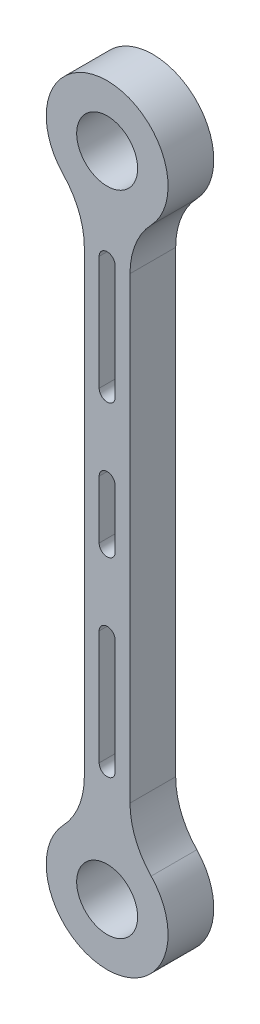
ISO-10303-21;
HEADER;
FILE_DESCRIPTION(('STEP AP214'),'2;1');
FILE_NAME('part.step','',(''),(''),'','','');
FILE_SCHEMA(('AUTOMOTIVE_DESIGN { 1 0 10303 214 1 1 1 1 }'));
ENDSEC;
DATA;
#1=APPLICATION_CONTEXT('core data for automotive mechanical design processes');
#2=APPLICATION_PROTOCOL_DEFINITION('international standard','automotive_design',2000,#1);
#3=PRODUCT_CONTEXT('',#1,'mechanical');
#4=PRODUCT('Part','Part','',(#3));
#5=PRODUCT_RELATED_PRODUCT_CATEGORY('part','',(#4));
#6=PRODUCT_DEFINITION_FORMATION('','',#4);
#7=PRODUCT_DEFINITION_CONTEXT('part definition',#1,'design');
#8=PRODUCT_DEFINITION('design','',#6,#7);
#9=PRODUCT_DEFINITION_SHAPE('','',#8);
#10=(LENGTH_UNIT() NAMED_UNIT(*) SI_UNIT(.MILLI.,.METRE.));
#11=(NAMED_UNIT(*) PLANE_ANGLE_UNIT() SI_UNIT($,.RADIAN.));
#12=(NAMED_UNIT(*) SI_UNIT($,.STERADIAN.) SOLID_ANGLE_UNIT());
#13=UNCERTAINTY_MEASURE_WITH_UNIT(LENGTH_MEASURE(1.E-05),#10,'distance_accuracy_value','');
#14=(GEOMETRIC_REPRESENTATION_CONTEXT(3) GLOBAL_UNCERTAINTY_ASSIGNED_CONTEXT((#13)) GLOBAL_UNIT_ASSIGNED_CONTEXT((#10,
#11,#12)) REPRESENTATION_CONTEXT('',''));
#15=CARTESIAN_POINT('',(0.,0.,0.));
#16=DIRECTION('',(0.,0.,1.));
#17=DIRECTION('',(1.,0.,0.));
#18=AXIS2_PLACEMENT_3D('',#15,#16,#17);
#19=CARTESIAN_POINT('',(3.,0.,6.));
#20=DIRECTION('',(1.,0.,0.));
#21=DIRECTION('',(0.,1.,0.));
#22=AXIS2_PLACEMENT_3D('',#19,#20,#21);
#23=PLANE('',#22);
#24=DIRECTION('',(0.,-1.,0.));
#25=VECTOR('',#24,1.);
#26=CARTESIAN_POINT('',(3.,0.,6.));
#27=LINE('',#26,#25);
#28=CARTESIAN_POINT('',(3.,-12.4498995979887,6.));
#29=VERTEX_POINT('',#28);
#30=CARTESIAN_POINT('',(3.00000000000001,-72.6501004020113,6.));
#31=VERTEX_POINT('',#30);
#32=EDGE_CURVE('E229',#29,#31,#27,.T.);
#33=ORIENTED_EDGE('',*,*,#32,.T.);
#34=DIRECTION('',(0.,0.,-1.));
#35=VECTOR('',#34,1.);
#36=CARTESIAN_POINT('',(3.00000000000001,-72.6501004020113,6.));
#37=LINE('',#36,#35);
#38=CARTESIAN_POINT('',(3.00000000000001,-72.6501004020113,0.));
#39=VERTEX_POINT('',#38);
#40=EDGE_CURVE('E317',#31,#39,#37,.T.);
#41=ORIENTED_EDGE('',*,*,#40,.T.);
#42=DIRECTION('',(0.,-1.,0.));
#43=VECTOR('',#42,1.);
#44=CARTESIAN_POINT('',(3.,0.,0.));
#45=LINE('',#44,#43);
#46=CARTESIAN_POINT('',(3.,-12.4498995979887,0.));
#47=VERTEX_POINT('',#46);
#48=EDGE_CURVE('E280',#47,#39,#45,.T.);
#49=ORIENTED_EDGE('',*,*,#48,.F.);
#50=DIRECTION('',(0.,0.,-1.));
#51=VECTOR('',#50,1.);
#52=CARTESIAN_POINT('',(3.,-12.4498995979887,6.));
#53=LINE('',#52,#51);
#54=EDGE_CURVE('E305',#47,#29,#53,.F.);
#55=ORIENTED_EDGE('',*,*,#54,.T.);
#56=EDGE_LOOP('',(#33,#41,#49,#55));
#57=FACE_BOUND('',#56,.T.);
#58=ADVANCED_FACE('F38',(#57),#23,.T.);
#59=CARTESIAN_POINT('',(0.,0.,6.));
#60=DIRECTION('',(0.,0.,-1.));
#61=DIRECTION('',(-1.,0.,0.));
#62=AXIS2_PLACEMENT_3D('',#59,#60,#61);
#63=CYLINDRICAL_SURFACE('',#62,8.);
#64=CARTESIAN_POINT('',(0.,0.,6.));
#65=DIRECTION('',(0.,0.,1.));
#66=DIRECTION('',(1.,0.,0.));
#67=AXIS2_PLACEMENT_3D('',#64,#65,#66);
#68=CIRCLE('',#67,8.);
#69=CARTESIAN_POINT('',(5.77777777777778,-5.53328871021721,6.));
#70=VERTEX_POINT('',#69);
#71=CARTESIAN_POINT('',(-5.77777777777778,-5.53328871021722,6.));
#72=VERTEX_POINT('',#71);
#73=EDGE_CURVE('E232',#70,#72,#68,.T.);
#74=ORIENTED_EDGE('',*,*,#73,.F.);
#75=DIRECTION('',(0.,0.,-1.));
#76=VECTOR('',#75,1.);
#77=CARTESIAN_POINT('',(5.77777777777778,-5.53328871021721,6.));
#78=LINE('',#77,#76);
#79=CARTESIAN_POINT('',(5.77777777777778,-5.53328871021721,0.));
#80=VERTEX_POINT('',#79);
#81=EDGE_CURVE('E331',#70,#80,#78,.T.);
#82=ORIENTED_EDGE('',*,*,#81,.T.);
#83=CARTESIAN_POINT('',(0.,0.,0.));
#84=DIRECTION('',(0.,0.,1.));
#85=DIRECTION('',(1.,0.,0.));
#86=AXIS2_PLACEMENT_3D('',#83,#84,#85);
#87=CIRCLE('',#86,8.);
#88=CARTESIAN_POINT('',(-5.77777777777778,-5.53328871021722,0.));
#89=VERTEX_POINT('',#88);
#90=EDGE_CURVE('E283',#80,#89,#87,.T.);
#91=ORIENTED_EDGE('',*,*,#90,.T.);
#92=DIRECTION('',(0.,0.,-1.));
#93=VECTOR('',#92,1.);
#94=CARTESIAN_POINT('',(-5.77777777777778,-5.53328871021722,6.));
#95=LINE('',#94,#93);
#96=EDGE_CURVE('E53',#89,#72,#95,.F.);
#97=ORIENTED_EDGE('',*,*,#96,.T.);
#98=EDGE_LOOP('',(#74,#82,#91,#97));
#99=FACE_BOUND('',#98,.T.);
#100=ADVANCED_FACE('F351',(#99),#63,.T.);
#101=CARTESIAN_POINT('',(-3.,0.,6.));
#102=DIRECTION('',(1.,0.,0.));
#103=DIRECTION('',(0.,1.,0.));
#104=AXIS2_PLACEMENT_3D('',#101,#102,#103);
#105=PLANE('',#104);
#106=DIRECTION('',(0.,-1.,0.));
#107=VECTOR('',#106,1.);
#108=CARTESIAN_POINT('',(-3.,0.,0.));
#109=LINE('',#108,#107);
#110=CARTESIAN_POINT('',(-3.,-12.4498995979887,0.));
#111=VERTEX_POINT('',#110);
#112=CARTESIAN_POINT('',(-2.99999999999999,-72.6501004020112,0.));
#113=VERTEX_POINT('',#112);
#114=EDGE_CURVE('E285',#111,#113,#109,.T.);
#115=ORIENTED_EDGE('',*,*,#114,.T.);
#116=DIRECTION('',(0.,0.,1.));
#117=VECTOR('',#116,1.);
#118=CARTESIAN_POINT('',(-2.99999999999999,-72.6501004020112,6.));
#119=LINE('',#118,#117);
#120=CARTESIAN_POINT('',(-2.99999999999999,-72.6501004020112,6.));
#121=VERTEX_POINT('',#120);
#122=EDGE_CURVE('E328',#113,#121,#119,.T.);
#123=ORIENTED_EDGE('',*,*,#122,.T.);
#124=DIRECTION('',(0.,-1.,0.));
#125=VECTOR('',#124,1.);
#126=CARTESIAN_POINT('',(-3.,0.,6.));
#127=LINE('',#126,#125);
#128=CARTESIAN_POINT('',(-3.,-12.4498995979887,6.));
#129=VERTEX_POINT('',#128);
#130=EDGE_CURVE('E234',#129,#121,#127,.T.);
#131=ORIENTED_EDGE('',*,*,#130,.F.);
#132=DIRECTION('',(0.,0.,1.));
#133=VECTOR('',#132,1.);
#134=CARTESIAN_POINT('',(-3.,-12.4498995979887,0.));
#135=LINE('',#134,#133);
#136=EDGE_CURVE('E325',#129,#111,#135,.F.);
#137=ORIENTED_EDGE('',*,*,#136,.T.);
#138=EDGE_LOOP('',(#115,#123,#131,#137));
#139=FACE_BOUND('',#138,.T.);
#140=ADVANCED_FACE('F358',(#139),#105,.F.);
#141=CARTESIAN_POINT('',(0.,-27.5,6.));
#142=DIRECTION('',(0.,0.,-1.));
#143=DIRECTION('',(-1.,0.,0.));
#144=AXIS2_PLACEMENT_3D('',#141,#142,#143);
#145=CYLINDRICAL_SURFACE('',#144,1.05);
#146=CARTESIAN_POINT('',(0.,-27.5,0.));
#147=DIRECTION('',(0.,0.,1.));
#148=DIRECTION('',(1.,0.,0.));
#149=AXIS2_PLACEMENT_3D('',#146,#147,#148);
#150=CIRCLE('',#149,1.05);
#151=CARTESIAN_POINT('',(-1.05,-27.5,0.));
#152=VERTEX_POINT('',#151);
#153=CARTESIAN_POINT('',(1.05,-27.5,0.));
#154=VERTEX_POINT('',#153);
#155=EDGE_CURVE('E268',#152,#154,#150,.T.);
#156=ORIENTED_EDGE('',*,*,#155,.F.);
#157=DIRECTION('',(0.,0.,-1.));
#158=VECTOR('',#157,1.);
#159=CARTESIAN_POINT('',(-1.05,-27.5,6.));
#160=LINE('',#159,#158);
#161=CARTESIAN_POINT('',(-1.05,-27.5,6.));
#162=VERTEX_POINT('',#161);
#163=EDGE_CURVE('E303',#162,#152,#160,.T.);
#164=ORIENTED_EDGE('',*,*,#163,.F.);
#165=CARTESIAN_POINT('',(0.,-27.5,6.));
#166=DIRECTION('',(0.,0.,1.));
#167=DIRECTION('',(1.,0.,0.));
#168=AXIS2_PLACEMENT_3D('',#165,#166,#167);
#169=CIRCLE('',#168,1.05);
#170=CARTESIAN_POINT('',(1.05,-27.5,6.));
#171=VERTEX_POINT('',#170);
#172=EDGE_CURVE('E218',#162,#171,#169,.T.);
#173=ORIENTED_EDGE('',*,*,#172,.T.);
#174=DIRECTION('',(0.,0.,-1.));
#175=VECTOR('',#174,1.);
#176=CARTESIAN_POINT('',(1.05,-27.5,6.));
#177=LINE('',#176,#175);
#178=EDGE_CURVE('E296',#171,#154,#177,.T.);
#179=ORIENTED_EDGE('',*,*,#178,.T.);
#180=EDGE_LOOP('',(#156,#164,#173,#179));
#181=FACE_BOUND('',#180,.T.);
#182=ADVANCED_FACE('F404',(#181),#145,.F.);
#183=CARTESIAN_POINT('',(-1.04999999999999,0.,6.));
#184=DIRECTION('',(1.,0.,0.));
#185=DIRECTION('',(0.,1.,0.));
#186=AXIS2_PLACEMENT_3D('',#183,#184,#185);
#187=PLANE('',#186);
#188=DIRECTION('',(0.,-1.,0.));
#189=VECTOR('',#188,1.);
#190=CARTESIAN_POINT('',(-1.04999999999999,0.,0.));
#191=LINE('',#190,#189);
#192=CARTESIAN_POINT('',(-1.04999999999999,-12.5,0.));
#193=VERTEX_POINT('',#192);
#194=EDGE_CURVE('E271',#193,#152,#191,.T.);
#195=ORIENTED_EDGE('',*,*,#194,.F.);
#196=DIRECTION('',(0.,0.,-1.));
#197=VECTOR('',#196,1.);
#198=CARTESIAN_POINT('',(-1.04999999999999,-12.5,6.));
#199=LINE('',#198,#197);
#200=CARTESIAN_POINT('',(-1.04999999999999,-12.5,6.));
#201=VERTEX_POINT('',#200);
#202=EDGE_CURVE('E301',#201,#193,#199,.T.);
#203=ORIENTED_EDGE('',*,*,#202,.F.);
#204=DIRECTION('',(0.,-1.,0.));
#205=VECTOR('',#204,1.);
#206=CARTESIAN_POINT('',(-1.04999999999999,0.,6.));
#207=LINE('',#206,#205);
#208=EDGE_CURVE('E221',#201,#162,#207,.T.);
#209=ORIENTED_EDGE('',*,*,#208,.T.);
#210=ORIENTED_EDGE('',*,*,#163,.T.);
#211=EDGE_LOOP('',(#195,#203,#209,#210));
#212=FACE_BOUND('',#211,.T.);
#213=ADVANCED_FACE('F400',(#212),#187,.T.);
#214=CARTESIAN_POINT('',(0.,-12.5,6.));
#215=DIRECTION('',(0.,0.,-1.));
#216=DIRECTION('',(-1.,0.,0.));
#217=AXIS2_PLACEMENT_3D('',#214,#215,#216);
#218=CYLINDRICAL_SURFACE('',#217,1.05);
#219=CARTESIAN_POINT('',(0.,-12.5,0.));
#220=DIRECTION('',(0.,0.,1.));
#221=DIRECTION('',(1.,0.,0.));
#222=AXIS2_PLACEMENT_3D('',#219,#220,#221);
#223=CIRCLE('',#222,1.05);
#224=CARTESIAN_POINT('',(1.05,-12.5,0.));
#225=VERTEX_POINT('',#224);
#226=EDGE_CURVE('E274',#225,#193,#223,.T.);
#227=ORIENTED_EDGE('',*,*,#226,.F.);
#228=DIRECTION('',(0.,0.,-1.));
#229=VECTOR('',#228,1.);
#230=CARTESIAN_POINT('',(1.05,-12.5,6.));
#231=LINE('',#230,#229);
#232=CARTESIAN_POINT('',(1.05,-12.5,6.));
#233=VERTEX_POINT('',#232);
#234=EDGE_CURVE('E298',#233,#225,#231,.T.);
#235=ORIENTED_EDGE('',*,*,#234,.F.);
#236=CARTESIAN_POINT('',(0.,-12.5,6.));
#237=DIRECTION('',(0.,0.,1.));
#238=DIRECTION('',(1.,0.,0.));
#239=AXIS2_PLACEMENT_3D('',#236,#237,#238);
#240=CIRCLE('',#239,1.05);
#241=EDGE_CURVE('E224',#233,#201,#240,.T.);
#242=ORIENTED_EDGE('',*,*,#241,.T.);
#243=ORIENTED_EDGE('',*,*,#202,.T.);
#244=EDGE_LOOP('',(#227,#235,#242,#243));
#245=FACE_BOUND('',#244,.T.);
#246=ADVANCED_FACE('F396',(#245),#218,.F.);
#247=CARTESIAN_POINT('',(0.,-45.1,6.));
#248=DIRECTION('',(0.,0.,-1.));
#249=DIRECTION('',(-1.,0.,0.));
#250=AXIS2_PLACEMENT_3D('',#247,#248,#249);
#251=CYLINDRICAL_SURFACE('',#250,1.05);
#252=CARTESIAN_POINT('',(0.,-45.1,0.));
#253=DIRECTION('',(0.,0.,1.));
#254=DIRECTION('',(1.,0.,0.));
#255=AXIS2_PLACEMENT_3D('',#252,#253,#254);
#256=CIRCLE('',#255,1.05);
#257=CARTESIAN_POINT('',(-1.04999999999999,-45.1,0.));
#258=VERTEX_POINT('',#257);
#259=CARTESIAN_POINT('',(1.05000000000001,-45.1,0.));
#260=VERTEX_POINT('',#259);
#261=EDGE_CURVE('E256',#258,#260,#256,.T.);
#262=ORIENTED_EDGE('',*,*,#261,.F.);
#263=DIRECTION('',(0.,0.,-1.));
#264=VECTOR('',#263,1.);
#265=CARTESIAN_POINT('',(-1.04999999999999,-45.1,6.));
#266=LINE('',#265,#264);
#267=CARTESIAN_POINT('',(-1.04999999999999,-45.1,6.));
#268=VERTEX_POINT('',#267);
#269=EDGE_CURVE('E299',#268,#258,#266,.T.);
#270=ORIENTED_EDGE('',*,*,#269,.F.);
#271=CARTESIAN_POINT('',(0.,-45.1,6.));
#272=DIRECTION('',(0.,0.,1.));
#273=DIRECTION('',(1.,0.,0.));
#274=AXIS2_PLACEMENT_3D('',#271,#272,#273);
#275=CIRCLE('',#274,1.05);
#276=CARTESIAN_POINT('',(1.05000000000001,-45.1,6.));
#277=VERTEX_POINT('',#276);
#278=EDGE_CURVE('E207',#268,#277,#275,.T.);
#279=ORIENTED_EDGE('',*,*,#278,.T.);
#280=DIRECTION('',(0.,0.,-1.));
#281=VECTOR('',#280,1.);
#282=CARTESIAN_POINT('',(1.05000000000001,-45.1,6.));
#283=LINE('',#282,#281);
#284=EDGE_CURVE('E186',#277,#260,#283,.T.);
#285=ORIENTED_EDGE('',*,*,#284,.T.);
#286=EDGE_LOOP('',(#262,#270,#279,#285));
#287=FACE_BOUND('',#286,.T.);
#288=ADVANCED_FACE('F399',(#287),#251,.F.);
#289=CARTESIAN_POINT('',(-1.04999999999998,0.,6.));
#290=DIRECTION('',(1.,0.,0.));
#291=DIRECTION('',(0.,1.,0.));
#292=AXIS2_PLACEMENT_3D('',#289,#290,#291);
#293=PLANE('',#292);
#294=DIRECTION('',(0.,-1.,0.));
#295=VECTOR('',#294,1.);
#296=CARTESIAN_POINT('',(-1.04999999999998,0.,0.));
#297=LINE('',#296,#295);
#298=CARTESIAN_POINT('',(-1.04999999999999,-37.5,0.));
#299=VERTEX_POINT('',#298);
#300=EDGE_CURVE('E259',#299,#258,#297,.T.);
#301=ORIENTED_EDGE('',*,*,#300,.F.);
#302=DIRECTION('',(0.,0.,-1.));
#303=VECTOR('',#302,1.);
#304=CARTESIAN_POINT('',(-1.04999999999999,-37.5,6.));
#305=LINE('',#304,#303);
#306=CARTESIAN_POINT('',(-1.04999999999999,-37.5,6.));
#307=VERTEX_POINT('',#306);
#308=EDGE_CURVE('E309',#307,#299,#305,.T.);
#309=ORIENTED_EDGE('',*,*,#308,.F.);
#310=DIRECTION('',(0.,-1.,0.));
#311=VECTOR('',#310,1.);
#312=CARTESIAN_POINT('',(-1.04999999999998,0.,6.));
#313=LINE('',#312,#311);
#314=EDGE_CURVE('E210',#307,#268,#313,.T.);
#315=ORIENTED_EDGE('',*,*,#314,.T.);
#316=ORIENTED_EDGE('',*,*,#269,.T.);
#317=EDGE_LOOP('',(#301,#309,#315,#316));
#318=FACE_BOUND('',#317,.T.);
#319=ADVANCED_FACE('F416',(#318),#293,.T.);
#320=CARTESIAN_POINT('',(0.,-37.5,6.));
#321=DIRECTION('',(0.,0.,-1.));
#322=DIRECTION('',(-1.,0.,0.));
#323=AXIS2_PLACEMENT_3D('',#320,#321,#322);
#324=CYLINDRICAL_SURFACE('',#323,1.04999999999999);
#325=CARTESIAN_POINT('',(0.,-37.5,0.));
#326=DIRECTION('',(0.,0.,1.));
#327=DIRECTION('',(1.,0.,0.));
#328=AXIS2_PLACEMENT_3D('',#325,#326,#327);
#329=CIRCLE('',#328,1.04999999999999);
#330=CARTESIAN_POINT('',(1.04999999999999,-37.5,0.));
#331=VERTEX_POINT('',#330);
#332=EDGE_CURVE('E262',#331,#299,#329,.T.);
#333=ORIENTED_EDGE('',*,*,#332,.F.);
#334=DIRECTION('',(0.,0.,-1.));
#335=VECTOR('',#334,1.);
#336=CARTESIAN_POINT('',(1.04999999999999,-37.5,6.));
#337=LINE('',#336,#335);
#338=CARTESIAN_POINT('',(1.04999999999999,-37.5,6.));
#339=VERTEX_POINT('',#338);
#340=EDGE_CURVE('E307',#339,#331,#337,.T.);
#341=ORIENTED_EDGE('',*,*,#340,.F.);
#342=CARTESIAN_POINT('',(0.,-37.5,6.));
#343=DIRECTION('',(0.,0.,1.));
#344=DIRECTION('',(1.,0.,0.));
#345=AXIS2_PLACEMENT_3D('',#342,#343,#344);
#346=CIRCLE('',#345,1.04999999999999);
#347=EDGE_CURVE('E213',#339,#307,#346,.T.);
#348=ORIENTED_EDGE('',*,*,#347,.T.);
#349=ORIENTED_EDGE('',*,*,#308,.T.);
#350=EDGE_LOOP('',(#333,#341,#348,#349));
#351=FACE_BOUND('',#350,.T.);
#352=ADVANCED_FACE('F413',(#351),#324,.F.);
#353=CARTESIAN_POINT('',(0.,-70.1,6.));
#354=DIRECTION('',(0.,0.,-1.));
#355=DIRECTION('',(-1.,0.,0.));
#356=AXIS2_PLACEMENT_3D('',#353,#354,#355);
#357=CYLINDRICAL_SURFACE('',#356,1.05);
#358=CARTESIAN_POINT('',(0.,-70.1,0.));
#359=DIRECTION('',(0.,0.,1.));
#360=DIRECTION('',(1.,0.,0.));
#361=AXIS2_PLACEMENT_3D('',#358,#359,#360);
#362=CIRCLE('',#361,1.05);
#363=CARTESIAN_POINT('',(-1.04999999999999,-70.1,0.));
#364=VERTEX_POINT('',#363);
#365=CARTESIAN_POINT('',(1.05000000000001,-70.1,0.));
#366=VERTEX_POINT('',#365);
#367=EDGE_CURVE('E181',#364,#366,#362,.T.);
#368=ORIENTED_EDGE('',*,*,#367,.F.);
#369=DIRECTION('',(0.,0.,-1.));
#370=VECTOR('',#369,1.);
#371=CARTESIAN_POINT('',(-1.04999999999999,-70.1,6.));
#372=LINE('',#371,#370);
#373=CARTESIAN_POINT('',(-1.04999999999999,-70.1,6.));
#374=VERTEX_POINT('',#373);
#375=EDGE_CURVE('E176',#374,#364,#372,.T.);
#376=ORIENTED_EDGE('',*,*,#375,.F.);
#377=CARTESIAN_POINT('',(0.,-70.1,6.));
#378=DIRECTION('',(0.,0.,1.));
#379=DIRECTION('',(1.,0.,0.));
#380=AXIS2_PLACEMENT_3D('',#377,#378,#379);
#381=CIRCLE('',#380,1.05);
#382=CARTESIAN_POINT('',(1.05000000000001,-70.1,6.));
#383=VERTEX_POINT('',#382);
#384=EDGE_CURVE('E179',#374,#383,#381,.T.);
#385=ORIENTED_EDGE('',*,*,#384,.T.);
#386=DIRECTION('',(0.,0.,-1.));
#387=VECTOR('',#386,1.);
#388=CARTESIAN_POINT('',(1.05000000000001,-70.1,6.));
#389=LINE('',#388,#387);
#390=EDGE_CURVE('E246',#383,#366,#389,.T.);
#391=ORIENTED_EDGE('',*,*,#390,.T.);
#392=EDGE_LOOP('',(#368,#376,#385,#391));
#393=FACE_BOUND('',#392,.T.);
#394=ADVANCED_FACE('F178',(#393),#357,.F.);
#395=CARTESIAN_POINT('',(-1.05,0.,6.));
#396=DIRECTION('',(1.,0.,0.));
#397=DIRECTION('',(0.,1.,0.));
#398=AXIS2_PLACEMENT_3D('',#395,#396,#397);
#399=PLANE('',#398);
#400=DIRECTION('',(0.,-1.,0.));
#401=VECTOR('',#400,1.);
#402=CARTESIAN_POINT('',(-1.05,0.,0.));
#403=LINE('',#402,#401);
#404=CARTESIAN_POINT('',(-1.04999999999999,-55.1,0.));
#405=VERTEX_POINT('',#404);
#406=EDGE_CURVE('E248',#405,#364,#403,.T.);
#407=ORIENTED_EDGE('',*,*,#406,.F.);
#408=DIRECTION('',(0.,0.,-1.));
#409=VECTOR('',#408,1.);
#410=CARTESIAN_POINT('',(-1.04999999999999,-55.1,6.));
#411=LINE('',#410,#409);
#412=CARTESIAN_POINT('',(-1.04999999999999,-55.1,6.));
#413=VERTEX_POINT('',#412);
#414=EDGE_CURVE('E187',#413,#405,#411,.T.);
#415=ORIENTED_EDGE('',*,*,#414,.F.);
#416=DIRECTION('',(0.,-1.,0.));
#417=VECTOR('',#416,1.);
#418=CARTESIAN_POINT('',(-1.05,0.,6.));
#419=LINE('',#418,#417);
#420=EDGE_CURVE('E194',#413,#374,#419,.T.);
#421=ORIENTED_EDGE('',*,*,#420,.T.);
#422=ORIENTED_EDGE('',*,*,#375,.T.);
#423=EDGE_LOOP('',(#407,#415,#421,#422));
#424=FACE_BOUND('',#423,.T.);
#425=ADVANCED_FACE('F201',(#424),#399,.T.);
#426=CARTESIAN_POINT('',(0.,-55.1,6.));
#427=DIRECTION('',(0.,0.,-1.));
#428=DIRECTION('',(-1.,0.,0.));
#429=AXIS2_PLACEMENT_3D('',#426,#427,#428);
#430=CYLINDRICAL_SURFACE('',#429,1.05);
#431=CARTESIAN_POINT('',(0.,-55.1,0.));
#432=DIRECTION('',(0.,0.,1.));
#433=DIRECTION('',(1.,0.,0.));
#434=AXIS2_PLACEMENT_3D('',#431,#432,#433);
#435=CIRCLE('',#434,1.05);
#436=CARTESIAN_POINT('',(1.05000000000001,-55.1,0.));
#437=VERTEX_POINT('',#436);
#438=EDGE_CURVE('E250',#437,#405,#435,.T.);
#439=ORIENTED_EDGE('',*,*,#438,.F.);
#440=DIRECTION('',(0.,0.,-1.));
#441=VECTOR('',#440,1.);
#442=CARTESIAN_POINT('',(1.05000000000001,-55.1,6.));
#443=LINE('',#442,#441);
#444=CARTESIAN_POINT('',(1.05000000000001,-55.1,6.));
#445=VERTEX_POINT('',#444);
#446=EDGE_CURVE('E313',#445,#437,#443,.T.);
#447=ORIENTED_EDGE('',*,*,#446,.F.);
#448=CARTESIAN_POINT('',(0.,-55.1,6.));
#449=DIRECTION('',(0.,0.,1.));
#450=DIRECTION('',(1.,0.,0.));
#451=AXIS2_PLACEMENT_3D('',#448,#449,#450);
#452=CIRCLE('',#451,1.05);
#453=EDGE_CURVE('E202',#445,#413,#452,.T.);
#454=ORIENTED_EDGE('',*,*,#453,.T.);
#455=ORIENTED_EDGE('',*,*,#414,.T.);
#456=EDGE_LOOP('',(#439,#447,#454,#455));
#457=FACE_BOUND('',#456,.T.);
#458=ADVANCED_FACE('F428',(#457),#430,.F.);
#459=CARTESIAN_POINT('',(0.,-85.1,6.));
#460=DIRECTION('',(0.,0.,-1.));
#461=DIRECTION('',(-1.,0.,0.));
#462=AXIS2_PLACEMENT_3D('',#459,#460,#461);
#463=CYLINDRICAL_SURFACE('',#462,4.);
#464=CARTESIAN_POINT('',(0.,-85.1,6.));
#465=DIRECTION('',(0.,0.,1.));
#466=DIRECTION('',(1.,0.,0.));
#467=AXIS2_PLACEMENT_3D('',#464,#465,#466);
#468=CIRCLE('',#467,4.);
#469=CARTESIAN_POINT('',(4.,-85.1,6.));
#470=VERTEX_POINT('',#469);
#471=EDGE_CURVE('E240',#470,#470,#468,.T.);
#472=ORIENTED_EDGE('',*,*,#471,.T.);
#473=EDGE_LOOP('',(#472));
#474=FACE_BOUND('',#473,.T.);
#475=CARTESIAN_POINT('',(0.,-85.1,0.));
#476=DIRECTION('',(0.,0.,1.));
#477=DIRECTION('',(1.,0.,0.));
#478=AXIS2_PLACEMENT_3D('',#475,#476,#477);
#479=CIRCLE('',#478,4.);
#480=CARTESIAN_POINT('',(4.,-85.1,0.));
#481=VERTEX_POINT('',#480);
#482=EDGE_CURVE('E291',#481,#481,#479,.T.);
#483=ORIENTED_EDGE('',*,*,#482,.F.);
#484=EDGE_LOOP('',(#483));
#485=FACE_BOUND('',#484,.T.);
#486=ADVANCED_FACE('F431',(#474,#485),#463,.F.);
#487=CARTESIAN_POINT('',(0.,-85.1,6.));
#488=DIRECTION('',(0.,0.,-1.));
#489=DIRECTION('',(-1.,0.,0.));
#490=AXIS2_PLACEMENT_3D('',#487,#488,#489);
#491=CYLINDRICAL_SURFACE('',#490,8.);
#492=CARTESIAN_POINT('',(0.,-85.1,0.));
#493=DIRECTION('',(0.,0.,1.));
#494=DIRECTION('',(1.,0.,0.));
#495=AXIS2_PLACEMENT_3D('',#492,#493,#494);
#496=CIRCLE('',#495,8.);
#497=CARTESIAN_POINT('',(-5.77777777777778,-79.5667112897828,0.));
#498=VERTEX_POINT('',#497);
#499=CARTESIAN_POINT('',(5.77777777777778,-79.5667112897828,0.));
#500=VERTEX_POINT('',#499);
#501=EDGE_CURVE('E288',#498,#500,#496,.T.);
#502=ORIENTED_EDGE('',*,*,#501,.T.);
#503=DIRECTION('',(0.,0.,-1.));
#504=VECTOR('',#503,1.);
#505=CARTESIAN_POINT('',(5.77777777777778,-79.5667112897828,6.));
#506=LINE('',#505,#504);
#507=CARTESIAN_POINT('',(5.77777777777778,-79.5667112897828,6.));
#508=VERTEX_POINT('',#507);
#509=EDGE_CURVE('E323',#500,#508,#506,.F.);
#510=ORIENTED_EDGE('',*,*,#509,.T.);
#511=CARTESIAN_POINT('',(0.,-85.1,6.));
#512=DIRECTION('',(0.,0.,1.));
#513=DIRECTION('',(1.,0.,0.));
#514=AXIS2_PLACEMENT_3D('',#511,#512,#513);
#515=CIRCLE('',#514,8.);
#516=CARTESIAN_POINT('',(-5.77777777777778,-79.5667112897828,6.));
#517=VERTEX_POINT('',#516);
#518=EDGE_CURVE('E237',#517,#508,#515,.T.);
#519=ORIENTED_EDGE('',*,*,#518,.F.);
#520=DIRECTION('',(0.,0.,-1.));
#521=VECTOR('',#520,1.);
#522=CARTESIAN_POINT('',(-5.77777777777778,-79.5667112897828,6.));
#523=LINE('',#522,#521);
#524=EDGE_CURVE('E320',#517,#498,#523,.T.);
#525=ORIENTED_EDGE('',*,*,#524,.T.);
#526=EDGE_LOOP('',(#502,#510,#519,#525));
#527=FACE_BOUND('',#526,.T.);
#528=ADVANCED_FACE('F366',(#527),#491,.T.);
#529=CARTESIAN_POINT('',(1.05,0.,6.));
#530=DIRECTION('',(1.,0.,0.));
#531=DIRECTION('',(0.,1.,0.));
#532=AXIS2_PLACEMENT_3D('',#529,#530,#531);
#533=PLANE('',#532);
#534=DIRECTION('',(0.,-1.,0.));
#535=VECTOR('',#534,1.);
#536=CARTESIAN_POINT('',(1.05,0.,0.));
#537=LINE('',#536,#535);
#538=EDGE_CURVE('E277',#225,#154,#537,.T.);
#539=ORIENTED_EDGE('',*,*,#538,.T.);
#540=ORIENTED_EDGE('',*,*,#178,.F.);
#541=DIRECTION('',(0.,-1.,0.));
#542=VECTOR('',#541,1.);
#543=CARTESIAN_POINT('',(1.05,0.,6.));
#544=LINE('',#543,#542);
#545=EDGE_CURVE('E227',#233,#171,#544,.T.);
#546=ORIENTED_EDGE('',*,*,#545,.F.);
#547=ORIENTED_EDGE('',*,*,#234,.T.);
#548=EDGE_LOOP('',(#539,#540,#546,#547));
#549=FACE_BOUND('',#548,.T.);
#550=ADVANCED_FACE('F391',(#549),#533,.F.);
#551=CARTESIAN_POINT('',(1.04999999999993,0.,6.));
#552=DIRECTION('',(1.,0.,0.));
#553=DIRECTION('',(0.,1.,0.));
#554=AXIS2_PLACEMENT_3D('',#551,#552,#553);
#555=PLANE('',#554);
#556=DIRECTION('',(0.,-1.,0.));
#557=VECTOR('',#556,1.);
#558=CARTESIAN_POINT('',(1.04999999999993,0.,0.));
#559=LINE('',#558,#557);
#560=EDGE_CURVE('E265',#331,#260,#559,.T.);
#561=ORIENTED_EDGE('',*,*,#560,.T.);
#562=ORIENTED_EDGE('',*,*,#284,.F.);
#563=DIRECTION('',(0.,-1.,0.));
#564=VECTOR('',#563,1.);
#565=CARTESIAN_POINT('',(1.04999999999993,0.,6.));
#566=LINE('',#565,#564);
#567=EDGE_CURVE('E216',#339,#277,#566,.T.);
#568=ORIENTED_EDGE('',*,*,#567,.F.);
#569=ORIENTED_EDGE('',*,*,#340,.T.);
#570=EDGE_LOOP('',(#561,#562,#568,#569));
#571=FACE_BOUND('',#570,.T.);
#572=ADVANCED_FACE('F394',(#571),#555,.F.);
#573=CARTESIAN_POINT('',(1.05,0.,6.));
#574=DIRECTION('',(1.,0.,0.));
#575=DIRECTION('',(0.,1.,0.));
#576=AXIS2_PLACEMENT_3D('',#573,#574,#575);
#577=PLANE('',#576);
#578=DIRECTION('',(0.,-1.,0.));
#579=VECTOR('',#578,1.);
#580=CARTESIAN_POINT('',(1.05,0.,0.));
#581=LINE('',#580,#579);
#582=EDGE_CURVE('E253',#437,#366,#581,.T.);
#583=ORIENTED_EDGE('',*,*,#582,.T.);
#584=ORIENTED_EDGE('',*,*,#390,.F.);
#585=DIRECTION('',(0.,-1.,0.));
#586=VECTOR('',#585,1.);
#587=CARTESIAN_POINT('',(1.05,0.,6.));
#588=LINE('',#587,#586);
#589=EDGE_CURVE('E197',#445,#383,#588,.T.);
#590=ORIENTED_EDGE('',*,*,#589,.F.);
#591=ORIENTED_EDGE('',*,*,#446,.T.);
#592=EDGE_LOOP('',(#583,#584,#590,#591));
#593=FACE_BOUND('',#592,.T.);
#594=ADVANCED_FACE('F411',(#593),#577,.F.);
#595=CARTESIAN_POINT('',(0.,0.,6.));
#596=DIRECTION('',(0.,0.,-1.));
#597=DIRECTION('',(-1.,0.,0.));
#598=AXIS2_PLACEMENT_3D('',#595,#596,#597);
#599=CYLINDRICAL_SURFACE('',#598,4.);
#600=CARTESIAN_POINT('',(0.,0.,6.));
#601=DIRECTION('',(0.,0.,1.));
#602=DIRECTION('',(1.,0.,0.));
#603=AXIS2_PLACEMENT_3D('',#600,#601,#602);
#604=CIRCLE('',#603,4.);
#605=CARTESIAN_POINT('',(4.,0.,6.));
#606=VERTEX_POINT('',#605);
#607=EDGE_CURVE('E243',#606,#606,#604,.T.);
#608=ORIENTED_EDGE('',*,*,#607,.T.);
#609=EDGE_LOOP('',(#608));
#610=FACE_BOUND('',#609,.T.);
#611=CARTESIAN_POINT('',(0.,0.,0.));
#612=DIRECTION('',(0.,0.,1.));
#613=DIRECTION('',(1.,0.,0.));
#614=AXIS2_PLACEMENT_3D('',#611,#612,#613);
#615=CIRCLE('',#614,4.);
#616=CARTESIAN_POINT('',(4.,0.,0.));
#617=VERTEX_POINT('',#616);
#618=EDGE_CURVE('E199',#617,#617,#615,.T.);
#619=ORIENTED_EDGE('',*,*,#618,.F.);
#620=EDGE_LOOP('',(#619));
#621=FACE_BOUND('',#620,.T.);
#622=ADVANCED_FACE('F426',(#610,#621),#599,.F.);
#623=CARTESIAN_POINT('',(0.,0.,6.));
#624=DIRECTION('',(0.,0.,1.));
#625=DIRECTION('',(1.,0.,0.));
#626=AXIS2_PLACEMENT_3D('',#623,#624,#625);
#627=PLANE('',#626);
#628=ORIENTED_EDGE('',*,*,#384,.F.);
#629=ORIENTED_EDGE('',*,*,#420,.F.);
#630=ORIENTED_EDGE('',*,*,#453,.F.);
#631=ORIENTED_EDGE('',*,*,#589,.T.);
#632=EDGE_LOOP('',(#628,#629,#630,#631));
#633=FACE_BOUND('',#632,.T.);
#634=ORIENTED_EDGE('',*,*,#278,.F.);
#635=ORIENTED_EDGE('',*,*,#314,.F.);
#636=ORIENTED_EDGE('',*,*,#347,.F.);
#637=ORIENTED_EDGE('',*,*,#567,.T.);
#638=EDGE_LOOP('',(#634,#635,#636,#637));
#639=FACE_BOUND('',#638,.T.);
#640=ORIENTED_EDGE('',*,*,#172,.F.);
#641=ORIENTED_EDGE('',*,*,#208,.F.);
#642=ORIENTED_EDGE('',*,*,#241,.F.);
#643=ORIENTED_EDGE('',*,*,#545,.T.);
#644=EDGE_LOOP('',(#640,#641,#642,#643));
#645=FACE_BOUND('',#644,.T.);
#646=ORIENTED_EDGE('',*,*,#32,.F.);
#647=CARTESIAN_POINT('',(13.,-12.4498995979887,6.));
#648=DIRECTION('',(0.,0.,1.));
#649=DIRECTION('',(1.,0.,0.));
#650=AXIS2_PLACEMENT_3D('',#647,#648,#649);
#651=CIRCLE('',#650,10.);
#652=EDGE_CURVE('E60',#29,#70,#651,.F.);
#653=ORIENTED_EDGE('',*,*,#652,.T.);
#654=ORIENTED_EDGE('',*,*,#73,.T.);
#655=CARTESIAN_POINT('',(-13.,-12.4498995979887,6.));
#656=DIRECTION('',(0.,0.,1.));
#657=DIRECTION('',(1.,0.,0.));
#658=AXIS2_PLACEMENT_3D('',#655,#656,#657);
#659=CIRCLE('',#658,10.);
#660=EDGE_CURVE('E11',#72,#129,#659,.F.);
#661=ORIENTED_EDGE('',*,*,#660,.T.);
#662=ORIENTED_EDGE('',*,*,#130,.T.);
#663=CARTESIAN_POINT('',(-13.,-72.6501004020112,6.));
#664=DIRECTION('',(0.,0.,1.));
#665=DIRECTION('',(1.,0.,0.));
#666=AXIS2_PLACEMENT_3D('',#663,#664,#665);
#667=CIRCLE('',#666,10.);
#668=EDGE_CURVE('E340',#121,#517,#667,.F.);
#669=ORIENTED_EDGE('',*,*,#668,.T.);
#670=ORIENTED_EDGE('',*,*,#518,.T.);
#671=CARTESIAN_POINT('',(13.,-72.6501004020113,6.));
#672=DIRECTION('',(0.,0.,1.));
#673=DIRECTION('',(1.,0.,0.));
#674=AXIS2_PLACEMENT_3D('',#671,#672,#673);
#675=CIRCLE('',#674,10.);
#676=EDGE_CURVE('E336',#508,#31,#675,.F.);
#677=ORIENTED_EDGE('',*,*,#676,.T.);
#678=EDGE_LOOP('',(#646,#653,#654,#661,#662,#669,#670,#677));
#679=FACE_BOUND('',#678,.T.);
#680=ORIENTED_EDGE('',*,*,#471,.F.);
#681=EDGE_LOOP('',(#680));
#682=FACE_BOUND('',#681,.T.);
#683=ORIENTED_EDGE('',*,*,#607,.F.);
#684=EDGE_LOOP('',(#683));
#685=FACE_BOUND('',#684,.T.);
#686=ADVANCED_FACE('F191',(#633,#639,#645,#679,#682,#685),#627,.T.);
#687=CARTESIAN_POINT('',(0.,0.,0.));
#688=DIRECTION('',(0.,0.,1.));
#689=DIRECTION('',(1.,0.,0.));
#690=AXIS2_PLACEMENT_3D('',#687,#688,#689);
#691=PLANE('',#690);
#692=ORIENTED_EDGE('',*,*,#367,.T.);
#693=ORIENTED_EDGE('',*,*,#582,.F.);
#694=ORIENTED_EDGE('',*,*,#438,.T.);
#695=ORIENTED_EDGE('',*,*,#406,.T.);
#696=EDGE_LOOP('',(#692,#693,#694,#695));
#697=FACE_BOUND('',#696,.T.);
#698=ORIENTED_EDGE('',*,*,#261,.T.);
#699=ORIENTED_EDGE('',*,*,#560,.F.);
#700=ORIENTED_EDGE('',*,*,#332,.T.);
#701=ORIENTED_EDGE('',*,*,#300,.T.);
#702=EDGE_LOOP('',(#698,#699,#700,#701));
#703=FACE_BOUND('',#702,.T.);
#704=ORIENTED_EDGE('',*,*,#155,.T.);
#705=ORIENTED_EDGE('',*,*,#538,.F.);
#706=ORIENTED_EDGE('',*,*,#226,.T.);
#707=ORIENTED_EDGE('',*,*,#194,.T.);
#708=EDGE_LOOP('',(#704,#705,#706,#707));
#709=FACE_BOUND('',#708,.T.);
#710=ORIENTED_EDGE('',*,*,#90,.F.);
#711=CARTESIAN_POINT('',(13.,-12.4498995979887,0.));
#712=DIRECTION('',(0.,0.,1.));
#713=DIRECTION('',(1.,0.,0.));
#714=AXIS2_PLACEMENT_3D('',#711,#712,#713);
#715=CIRCLE('',#714,10.);
#716=EDGE_CURVE('E342',#80,#47,#715,.T.);
#717=ORIENTED_EDGE('',*,*,#716,.T.);
#718=ORIENTED_EDGE('',*,*,#48,.T.);
#719=CARTESIAN_POINT('',(13.,-72.6501004020113,0.));
#720=DIRECTION('',(0.,0.,1.));
#721=DIRECTION('',(1.,0.,0.));
#722=AXIS2_PLACEMENT_3D('',#719,#720,#721);
#723=CIRCLE('',#722,10.);
#724=EDGE_CURVE('E334',#39,#500,#723,.T.);
#725=ORIENTED_EDGE('',*,*,#724,.T.);
#726=ORIENTED_EDGE('',*,*,#501,.F.);
#727=CARTESIAN_POINT('',(-13.,-72.6501004020112,0.));
#728=DIRECTION('',(0.,0.,1.));
#729=DIRECTION('',(1.,0.,0.));
#730=AXIS2_PLACEMENT_3D('',#727,#728,#729);
#731=CIRCLE('',#730,10.);
#732=EDGE_CURVE('E338',#498,#113,#731,.T.);
#733=ORIENTED_EDGE('',*,*,#732,.T.);
#734=ORIENTED_EDGE('',*,*,#114,.F.);
#735=CARTESIAN_POINT('',(-13.,-12.4498995979887,0.));
#736=DIRECTION('',(0.,0.,1.));
#737=DIRECTION('',(1.,0.,0.));
#738=AXIS2_PLACEMENT_3D('',#735,#736,#737);
#739=CIRCLE('',#738,10.);
#740=EDGE_CURVE('E46',#111,#89,#739,.T.);
#741=ORIENTED_EDGE('',*,*,#740,.T.);
#742=EDGE_LOOP('',(#710,#717,#718,#725,#726,#733,#734,#741));
#743=FACE_BOUND('',#742,.T.);
#744=ORIENTED_EDGE('',*,*,#482,.T.);
#745=EDGE_LOOP('',(#744));
#746=FACE_BOUND('',#745,.T.);
#747=ORIENTED_EDGE('',*,*,#618,.T.);
#748=EDGE_LOOP('',(#747));
#749=FACE_BOUND('',#748,.T.);
#750=ADVANCED_FACE('F347',(#697,#703,#709,#743,#746,#749),#691,.F.);
#751=CARTESIAN_POINT('',(13.,-72.6501004020113,6.));
#752=DIRECTION('',(0.,0.,-1.));
#753=DIRECTION('',(-1.,0.,0.));
#754=AXIS2_PLACEMENT_3D('',#751,#752,#753);
#755=CYLINDRICAL_SURFACE('',#754,10.);
#756=ORIENTED_EDGE('',*,*,#676,.F.);
#757=ORIENTED_EDGE('',*,*,#509,.F.);
#758=ORIENTED_EDGE('',*,*,#724,.F.);
#759=ORIENTED_EDGE('',*,*,#40,.F.);
#760=EDGE_LOOP('',(#756,#757,#758,#759));
#761=FACE_BOUND('',#760,.T.);
#762=ADVANCED_FACE('F370',(#761),#755,.F.);
#763=CARTESIAN_POINT('',(-13.,-72.6501004020112,6.));
#764=DIRECTION('',(0.,0.,-1.));
#765=DIRECTION('',(-1.,0.,0.));
#766=AXIS2_PLACEMENT_3D('',#763,#764,#765);
#767=CYLINDRICAL_SURFACE('',#766,10.);
#768=ORIENTED_EDGE('',*,*,#668,.F.);
#769=ORIENTED_EDGE('',*,*,#122,.F.);
#770=ORIENTED_EDGE('',*,*,#732,.F.);
#771=ORIENTED_EDGE('',*,*,#524,.F.);
#772=EDGE_LOOP('',(#768,#769,#770,#771));
#773=FACE_BOUND('',#772,.T.);
#774=ADVANCED_FACE('F361',(#773),#767,.F.);
#775=CARTESIAN_POINT('',(13.,-12.4498995979887,6.));
#776=DIRECTION('',(0.,0.,-1.));
#777=DIRECTION('',(-1.,0.,0.));
#778=AXIS2_PLACEMENT_3D('',#775,#776,#777);
#779=CYLINDRICAL_SURFACE('',#778,10.);
#780=ORIENTED_EDGE('',*,*,#652,.F.);
#781=ORIENTED_EDGE('',*,*,#54,.F.);
#782=ORIENTED_EDGE('',*,*,#716,.F.);
#783=ORIENTED_EDGE('',*,*,#81,.F.);
#784=EDGE_LOOP('',(#780,#781,#782,#783));
#785=FACE_BOUND('',#784,.T.);
#786=ADVANCED_FACE('F376',(#785),#779,.F.);
#787=CARTESIAN_POINT('',(-13.,-12.4498995979887,6.));
#788=DIRECTION('',(0.,0.,-1.));
#789=DIRECTION('',(-1.,0.,0.));
#790=AXIS2_PLACEMENT_3D('',#787,#788,#789);
#791=CYLINDRICAL_SURFACE('',#790,10.);
#792=ORIENTED_EDGE('',*,*,#660,.F.);
#793=ORIENTED_EDGE('',*,*,#96,.F.);
#794=ORIENTED_EDGE('',*,*,#740,.F.);
#795=ORIENTED_EDGE('',*,*,#136,.F.);
#796=EDGE_LOOP('',(#792,#793,#794,#795));
#797=FACE_BOUND('',#796,.T.);
#798=ADVANCED_FACE('F40',(#797),#791,.F.);
#799=CLOSED_SHELL('',(#58,#100,#140,#182,#213,#246,#288,#319,#352,#394,#425,#458,#486,#528,#550,
#572,#594,#622,#686,#750,#762,#774,#786,#798));
#800=MANIFOLD_SOLID_BREP('B2',#799);
#801=ADVANCED_BREP_SHAPE_REPRESENTATION('',(#18,#800),#14);
#802=SHAPE_DEFINITION_REPRESENTATION(#9,#801);
ENDSEC;
END-ISO-10303-21;
